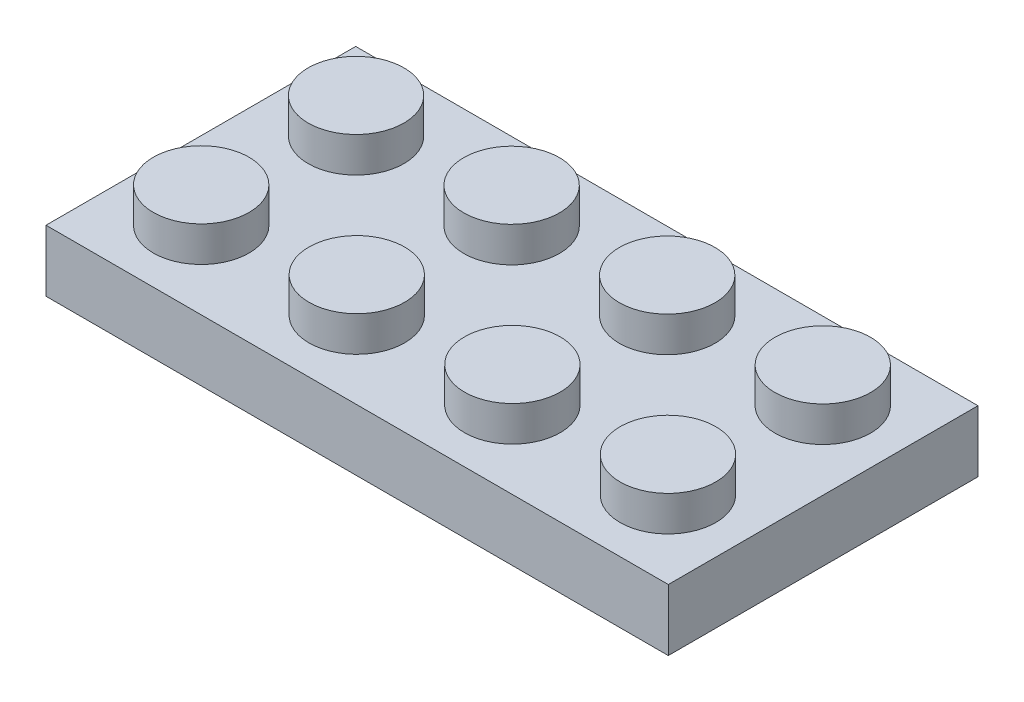
ISO-10303-21;
HEADER;
FILE_DESCRIPTION(('STEP AP214'),'2;1');
FILE_NAME('part.step','',(''),(''),'','','');
FILE_SCHEMA(('AUTOMOTIVE_DESIGN { 1 0 10303 214 1 1 1 1 }'));
ENDSEC;
DATA;
#1=APPLICATION_CONTEXT('core data for automotive mechanical design processes');
#2=APPLICATION_PROTOCOL_DEFINITION('international standard','automotive_design',2000,#1);
#3=PRODUCT_CONTEXT('',#1,'mechanical');
#4=PRODUCT('Part','Part','',(#3));
#5=PRODUCT_RELATED_PRODUCT_CATEGORY('part','',(#4));
#6=PRODUCT_DEFINITION_FORMATION('','',#4);
#7=PRODUCT_DEFINITION_CONTEXT('part definition',#1,'design');
#8=PRODUCT_DEFINITION('design','',#6,#7);
#9=PRODUCT_DEFINITION_SHAPE('','',#8);
#10=(LENGTH_UNIT() NAMED_UNIT(*) SI_UNIT(.MILLI.,.METRE.));
#11=(NAMED_UNIT(*) PLANE_ANGLE_UNIT() SI_UNIT($,.RADIAN.));
#12=(NAMED_UNIT(*) SI_UNIT($,.STERADIAN.) SOLID_ANGLE_UNIT());
#13=UNCERTAINTY_MEASURE_WITH_UNIT(LENGTH_MEASURE(1.E-05),#10,'distance_accuracy_value','');
#14=(GEOMETRIC_REPRESENTATION_CONTEXT(3) GLOBAL_UNCERTAINTY_ASSIGNED_CONTEXT((#13)) GLOBAL_UNIT_ASSIGNED_CONTEXT((#10,
#11,#12)) REPRESENTATION_CONTEXT('',''));
#15=CARTESIAN_POINT('',(0.,0.,0.));
#16=DIRECTION('',(0.,0.,1.));
#17=DIRECTION('',(1.,0.,0.));
#18=AXIS2_PLACEMENT_3D('',#15,#16,#17);
#19=CARTESIAN_POINT('',(15.925,-3.15,-7.925));
#20=DIRECTION('',(1.,0.,0.));
#21=DIRECTION('',(0.,0.,-1.));
#22=AXIS2_PLACEMENT_3D('',#19,#20,#21);
#23=PLANE('',#22);
#24=DIRECTION('',(0.,0.,-1.));
#25=VECTOR('',#24,1.);
#26=CARTESIAN_POINT('',(15.925,0.,-7.925));
#27=LINE('',#26,#25);
#28=CARTESIAN_POINT('',(15.925,0.,7.925));
#29=VERTEX_POINT('',#28);
#30=CARTESIAN_POINT('',(15.925,0.,-7.925));
#31=VERTEX_POINT('',#30);
#32=EDGE_CURVE('E243',#29,#31,#27,.T.);
#33=ORIENTED_EDGE('',*,*,#32,.F.);
#34=DIRECTION('',(0.,1.,0.));
#35=VECTOR('',#34,1.);
#36=CARTESIAN_POINT('',(15.925,-3.15,7.925));
#37=LINE('',#36,#35);
#38=CARTESIAN_POINT('',(15.925,-3.15,7.925));
#39=VERTEX_POINT('',#38);
#40=EDGE_CURVE('E58',#39,#29,#37,.T.);
#41=ORIENTED_EDGE('',*,*,#40,.F.);
#42=DIRECTION('',(0.,0.,-1.));
#43=VECTOR('',#42,1.);
#44=CARTESIAN_POINT('',(15.925,-3.15,-7.925));
#45=LINE('',#44,#43);
#46=CARTESIAN_POINT('',(15.925,-3.15,-7.925));
#47=VERTEX_POINT('',#46);
#48=EDGE_CURVE('E246',#39,#47,#45,.T.);
#49=ORIENTED_EDGE('',*,*,#48,.T.);
#50=DIRECTION('',(0.,1.,0.));
#51=VECTOR('',#50,1.);
#52=CARTESIAN_POINT('',(15.925,-3.15,-7.925));
#53=LINE('',#52,#51);
#54=EDGE_CURVE('E84',#47,#31,#53,.T.);
#55=ORIENTED_EDGE('',*,*,#54,.T.);
#56=EDGE_LOOP('',(#33,#41,#49,#55));
#57=FACE_BOUND('',#56,.T.);
#58=ADVANCED_FACE('F35',(#57),#23,.T.);
#59=CARTESIAN_POINT('',(-15.925,-3.15,7.925));
#60=DIRECTION('',(0.,0.,1.));
#61=DIRECTION('',(1.,0.,0.));
#62=AXIS2_PLACEMENT_3D('',#59,#60,#61);
#63=PLANE('',#62);
#64=DIRECTION('',(1.,0.,0.));
#65=VECTOR('',#64,1.);
#66=CARTESIAN_POINT('',(-15.925,0.,7.925));
#67=LINE('',#66,#65);
#68=CARTESIAN_POINT('',(-15.925,0.,7.925));
#69=VERTEX_POINT('',#68);
#70=EDGE_CURVE('E249',#69,#29,#67,.T.);
#71=ORIENTED_EDGE('',*,*,#70,.F.);
#72=DIRECTION('',(0.,1.,0.));
#73=VECTOR('',#72,1.);
#74=CARTESIAN_POINT('',(-15.925,-3.15,7.925));
#75=LINE('',#74,#73);
#76=CARTESIAN_POINT('',(-15.925,-3.15,7.925));
#77=VERTEX_POINT('',#76);
#78=EDGE_CURVE('E268',#77,#69,#75,.T.);
#79=ORIENTED_EDGE('',*,*,#78,.F.);
#80=DIRECTION('',(1.,0.,0.));
#81=VECTOR('',#80,1.);
#82=CARTESIAN_POINT('',(-15.925,-3.15,7.925));
#83=LINE('',#82,#81);
#84=EDGE_CURVE('E254',#77,#39,#83,.T.);
#85=ORIENTED_EDGE('',*,*,#84,.T.);
#86=ORIENTED_EDGE('',*,*,#40,.T.);
#87=EDGE_LOOP('',(#71,#79,#85,#86));
#88=FACE_BOUND('',#87,.T.);
#89=ADVANCED_FACE('F316',(#88),#63,.T.);
#90=CARTESIAN_POINT('',(-15.925,-3.15,-7.925));
#91=DIRECTION('',(-1.,0.,0.));
#92=DIRECTION('',(0.,0.,1.));
#93=AXIS2_PLACEMENT_3D('',#90,#91,#92);
#94=PLANE('',#93);
#95=DIRECTION('',(0.,0.,1.));
#96=VECTOR('',#95,1.);
#97=CARTESIAN_POINT('',(-15.925,0.,-7.925));
#98=LINE('',#97,#96);
#99=CARTESIAN_POINT('',(-15.925,0.,-7.925));
#100=VERTEX_POINT('',#99);
#101=EDGE_CURVE('E261',#100,#69,#98,.T.);
#102=ORIENTED_EDGE('',*,*,#101,.F.);
#103=DIRECTION('',(0.,1.,0.));
#104=VECTOR('',#103,1.);
#105=CARTESIAN_POINT('',(-15.925,-3.15,-7.925));
#106=LINE('',#105,#104);
#107=CARTESIAN_POINT('',(-15.925,-3.15,-7.925));
#108=VERTEX_POINT('',#107);
#109=EDGE_CURVE('E270',#108,#100,#106,.T.);
#110=ORIENTED_EDGE('',*,*,#109,.F.);
#111=DIRECTION('',(0.,0.,1.));
#112=VECTOR('',#111,1.);
#113=CARTESIAN_POINT('',(-15.925,-3.15,-7.925));
#114=LINE('',#113,#112);
#115=EDGE_CURVE('E251',#108,#77,#114,.T.);
#116=ORIENTED_EDGE('',*,*,#115,.T.);
#117=ORIENTED_EDGE('',*,*,#78,.T.);
#118=EDGE_LOOP('',(#102,#110,#116,#117));
#119=FACE_BOUND('',#118,.T.);
#120=ADVANCED_FACE('F320',(#119),#94,.T.);
#121=CARTESIAN_POINT('',(-15.925,-3.15,-7.925));
#122=DIRECTION('',(0.,0.,-1.));
#123=DIRECTION('',(-1.,0.,0.));
#124=AXIS2_PLACEMENT_3D('',#121,#122,#123);
#125=PLANE('',#124);
#126=DIRECTION('',(-1.,0.,0.));
#127=VECTOR('',#126,1.);
#128=CARTESIAN_POINT('',(-15.925,0.,-7.925));
#129=LINE('',#128,#127);
#130=EDGE_CURVE('E258',#31,#100,#129,.T.);
#131=ORIENTED_EDGE('',*,*,#130,.F.);
#132=ORIENTED_EDGE('',*,*,#54,.F.);
#133=DIRECTION('',(-1.,0.,0.));
#134=VECTOR('',#133,1.);
#135=CARTESIAN_POINT('',(-15.925,-3.15,-7.925));
#136=LINE('',#135,#134);
#137=EDGE_CURVE('E248',#47,#108,#136,.T.);
#138=ORIENTED_EDGE('',*,*,#137,.T.);
#139=ORIENTED_EDGE('',*,*,#109,.T.);
#140=EDGE_LOOP('',(#131,#132,#138,#139));
#141=FACE_BOUND('',#140,.T.);
#142=ADVANCED_FACE('F330',(#141),#125,.T.);
#143=CARTESIAN_POINT('',(0.,-3.15,0.));
#144=DIRECTION('',(0.,1.,0.));
#145=DIRECTION('',(0.,0.,1.));
#146=AXIS2_PLACEMENT_3D('',#143,#144,#145);
#147=PLANE('',#146);
#148=DIRECTION('',(1.,0.,0.));
#149=VECTOR('',#148,1.);
#150=CARTESIAN_POINT('',(0.,-3.15,6.425));
#151=LINE('',#150,#149);
#152=CARTESIAN_POINT('',(-14.425,-3.15,6.425));
#153=VERTEX_POINT('',#152);
#154=CARTESIAN_POINT('',(14.425,-3.15,6.425));
#155=VERTEX_POINT('',#154);
#156=EDGE_CURVE('E193',#153,#155,#151,.T.);
#157=ORIENTED_EDGE('',*,*,#156,.T.);
#158=DIRECTION('',(0.,0.,-1.));
#159=VECTOR('',#158,1.);
#160=CARTESIAN_POINT('',(14.425,-3.15,0.));
#161=LINE('',#160,#159);
#162=CARTESIAN_POINT('',(14.425,-3.15,-6.425));
#163=VERTEX_POINT('',#162);
#164=EDGE_CURVE('E113',#155,#163,#161,.T.);
#165=ORIENTED_EDGE('',*,*,#164,.T.);
#166=DIRECTION('',(-1.,0.,0.));
#167=VECTOR('',#166,1.);
#168=CARTESIAN_POINT('',(0.,-3.15,-6.425));
#169=LINE('',#168,#167);
#170=CARTESIAN_POINT('',(-14.425,-3.15,-6.425));
#171=VERTEX_POINT('',#170);
#172=EDGE_CURVE('E135',#163,#171,#169,.T.);
#173=ORIENTED_EDGE('',*,*,#172,.T.);
#174=DIRECTION('',(0.,0.,1.));
#175=VECTOR('',#174,1.);
#176=CARTESIAN_POINT('',(-14.425,-3.15,0.));
#177=LINE('',#176,#175);
#178=EDGE_CURVE('E49',#171,#153,#177,.T.);
#179=ORIENTED_EDGE('',*,*,#178,.T.);
#180=EDGE_LOOP('',(#157,#165,#173,#179));
#181=FACE_BOUND('',#180,.T.);
#182=ORIENTED_EDGE('',*,*,#48,.F.);
#183=ORIENTED_EDGE('',*,*,#84,.F.);
#184=ORIENTED_EDGE('',*,*,#115,.F.);
#185=ORIENTED_EDGE('',*,*,#137,.F.);
#186=EDGE_LOOP('',(#182,#183,#184,#185));
#187=FACE_BOUND('',#186,.T.);
#188=ADVANCED_FACE('F329',(#181,#187),#147,.F.);
#189=CARTESIAN_POINT('',(0.,0.,0.));
#190=DIRECTION('',(0.,1.,0.));
#191=DIRECTION('',(0.,0.,1.));
#192=AXIS2_PLACEMENT_3D('',#189,#190,#191);
#193=PLANE('',#192);
#194=CARTESIAN_POINT('',(-11.94375,0.,3.9625));
#195=DIRECTION('',(0.,1.,0.));
#196=DIRECTION('',(0.,0.,1.));
#197=AXIS2_PLACEMENT_3D('',#194,#195,#196);
#198=CIRCLE('',#197,2.45);
#199=CARTESIAN_POINT('',(-11.94375,0.,6.4125));
#200=VERTEX_POINT('',#199);
#201=EDGE_CURVE('E118',#200,#200,#198,.T.);
#202=ORIENTED_EDGE('',*,*,#201,.F.);
#203=EDGE_LOOP('',(#202));
#204=FACE_BOUND('',#203,.T.);
#205=CARTESIAN_POINT('',(11.94375,0.,3.9625));
#206=DIRECTION('',(0.,1.,0.));
#207=DIRECTION('',(0.,0.,1.));
#208=AXIS2_PLACEMENT_3D('',#205,#206,#207);
#209=CIRCLE('',#208,2.45);
#210=CARTESIAN_POINT('',(11.94375,0.,6.4125));
#211=VERTEX_POINT('',#210);
#212=EDGE_CURVE('E201',#211,#211,#209,.T.);
#213=ORIENTED_EDGE('',*,*,#212,.F.);
#214=EDGE_LOOP('',(#213));
#215=FACE_BOUND('',#214,.T.);
#216=CARTESIAN_POINT('',(3.98125,0.,3.9625));
#217=DIRECTION('',(0.,1.,0.));
#218=DIRECTION('',(0.,0.,1.));
#219=AXIS2_PLACEMENT_3D('',#216,#217,#218);
#220=CIRCLE('',#219,2.45);
#221=CARTESIAN_POINT('',(3.98125,0.,6.4125));
#222=VERTEX_POINT('',#221);
#223=EDGE_CURVE('E207',#222,#222,#220,.T.);
#224=ORIENTED_EDGE('',*,*,#223,.F.);
#225=EDGE_LOOP('',(#224));
#226=FACE_BOUND('',#225,.T.);
#227=CARTESIAN_POINT('',(-3.98125,0.,3.9625));
#228=DIRECTION('',(0.,1.,0.));
#229=DIRECTION('',(0.,0.,1.));
#230=AXIS2_PLACEMENT_3D('',#227,#228,#229);
#231=CIRCLE('',#230,2.45);
#232=CARTESIAN_POINT('',(-3.98125,0.,6.4125));
#233=VERTEX_POINT('',#232);
#234=EDGE_CURVE('E213',#233,#233,#231,.T.);
#235=ORIENTED_EDGE('',*,*,#234,.F.);
#236=EDGE_LOOP('',(#235));
#237=FACE_BOUND('',#236,.T.);
#238=CARTESIAN_POINT('',(11.94375,0.,-3.9625));
#239=DIRECTION('',(0.,1.,0.));
#240=DIRECTION('',(0.,0.,1.));
#241=AXIS2_PLACEMENT_3D('',#238,#239,#240);
#242=CIRCLE('',#241,2.45);
#243=CARTESIAN_POINT('',(11.94375,0.,-1.5125));
#244=VERTEX_POINT('',#243);
#245=EDGE_CURVE('E219',#244,#244,#242,.T.);
#246=ORIENTED_EDGE('',*,*,#245,.F.);
#247=EDGE_LOOP('',(#246));
#248=FACE_BOUND('',#247,.T.);
#249=CARTESIAN_POINT('',(3.98125,0.,-3.9625));
#250=DIRECTION('',(0.,1.,0.));
#251=DIRECTION('',(0.,0.,1.));
#252=AXIS2_PLACEMENT_3D('',#249,#250,#251);
#253=CIRCLE('',#252,2.45);
#254=CARTESIAN_POINT('',(3.98125,0.,-1.5125));
#255=VERTEX_POINT('',#254);
#256=EDGE_CURVE('E225',#255,#255,#253,.T.);
#257=ORIENTED_EDGE('',*,*,#256,.F.);
#258=EDGE_LOOP('',(#257));
#259=FACE_BOUND('',#258,.T.);
#260=CARTESIAN_POINT('',(-3.98125,0.,-3.9625));
#261=DIRECTION('',(0.,1.,0.));
#262=DIRECTION('',(0.,0.,1.));
#263=AXIS2_PLACEMENT_3D('',#260,#261,#262);
#264=CIRCLE('',#263,2.45);
#265=CARTESIAN_POINT('',(-3.98125,0.,-1.5125));
#266=VERTEX_POINT('',#265);
#267=EDGE_CURVE('E231',#266,#266,#264,.T.);
#268=ORIENTED_EDGE('',*,*,#267,.F.);
#269=EDGE_LOOP('',(#268));
#270=FACE_BOUND('',#269,.T.);
#271=CARTESIAN_POINT('',(-11.94375,0.,-3.9625));
#272=DIRECTION('',(0.,1.,0.));
#273=DIRECTION('',(0.,0.,1.));
#274=AXIS2_PLACEMENT_3D('',#271,#272,#273);
#275=CIRCLE('',#274,2.45);
#276=CARTESIAN_POINT('',(-11.94375,0.,-1.5125));
#277=VERTEX_POINT('',#276);
#278=EDGE_CURVE('E237',#277,#277,#275,.T.);
#279=ORIENTED_EDGE('',*,*,#278,.F.);
#280=EDGE_LOOP('',(#279));
#281=FACE_BOUND('',#280,.T.);
#282=ORIENTED_EDGE('',*,*,#32,.T.);
#283=ORIENTED_EDGE('',*,*,#130,.T.);
#284=ORIENTED_EDGE('',*,*,#101,.T.);
#285=ORIENTED_EDGE('',*,*,#70,.T.);
#286=EDGE_LOOP('',(#282,#283,#284,#285));
#287=FACE_BOUND('',#286,.T.);
#288=ADVANCED_FACE('F323',(#204,#215,#226,#237,#248,#259,#270,#281,#287),#193,.T.);
#289=CARTESIAN_POINT('',(-11.94375,1.8,-3.9625));
#290=DIRECTION('',(0.,-1.,0.));
#291=DIRECTION('',(0.,0.,-1.));
#292=AXIS2_PLACEMENT_3D('',#289,#290,#291);
#293=CYLINDRICAL_SURFACE('',#292,2.45);
#294=CARTESIAN_POINT('',(-11.94375,1.8,-3.9625));
#295=DIRECTION('',(0.,1.,0.));
#296=DIRECTION('',(0.,0.,1.));
#297=AXIS2_PLACEMENT_3D('',#294,#295,#296);
#298=CIRCLE('',#297,2.45);
#299=CARTESIAN_POINT('',(-11.94375,1.8,-1.5125));
#300=VERTEX_POINT('',#299);
#301=EDGE_CURVE('E240',#300,#300,#298,.T.);
#302=ORIENTED_EDGE('',*,*,#301,.F.);
#303=EDGE_LOOP('',(#302));
#304=FACE_BOUND('',#303,.T.);
#305=ORIENTED_EDGE('',*,*,#278,.T.);
#306=EDGE_LOOP('',(#305));
#307=FACE_BOUND('',#306,.T.);
#308=ADVANCED_FACE('F341',(#304,#307),#293,.T.);
#309=CARTESIAN_POINT('',(-11.94375,1.8,-3.9625));
#310=DIRECTION('',(0.,1.,0.));
#311=DIRECTION('',(0.,0.,1.));
#312=AXIS2_PLACEMENT_3D('',#309,#310,#311);
#313=PLANE('',#312);
#314=ORIENTED_EDGE('',*,*,#301,.T.);
#315=EDGE_LOOP('',(#314));
#316=FACE_BOUND('',#315,.T.);
#317=ADVANCED_FACE('F346',(#316),#313,.T.);
#318=CARTESIAN_POINT('',(-3.98125,1.8,-3.9625));
#319=DIRECTION('',(0.,-1.,0.));
#320=DIRECTION('',(0.,0.,-1.));
#321=AXIS2_PLACEMENT_3D('',#318,#319,#320);
#322=CYLINDRICAL_SURFACE('',#321,2.45);
#323=CARTESIAN_POINT('',(-3.98125,1.8,-3.9625));
#324=DIRECTION('',(0.,1.,0.));
#325=DIRECTION('',(0.,0.,1.));
#326=AXIS2_PLACEMENT_3D('',#323,#324,#325);
#327=CIRCLE('',#326,2.45);
#328=CARTESIAN_POINT('',(-3.98125,1.8,-1.5125));
#329=VERTEX_POINT('',#328);
#330=EDGE_CURVE('E234',#329,#329,#327,.T.);
#331=ORIENTED_EDGE('',*,*,#330,.F.);
#332=EDGE_LOOP('',(#331));
#333=FACE_BOUND('',#332,.T.);
#334=ORIENTED_EDGE('',*,*,#267,.T.);
#335=EDGE_LOOP('',(#334));
#336=FACE_BOUND('',#335,.T.);
#337=ADVANCED_FACE('F350',(#333,#336),#322,.T.);
#338=CARTESIAN_POINT('',(-3.98125,1.8,-3.9625));
#339=DIRECTION('',(0.,1.,0.));
#340=DIRECTION('',(0.,0.,1.));
#341=AXIS2_PLACEMENT_3D('',#338,#339,#340);
#342=PLANE('',#341);
#343=ORIENTED_EDGE('',*,*,#330,.T.);
#344=EDGE_LOOP('',(#343));
#345=FACE_BOUND('',#344,.T.);
#346=ADVANCED_FACE('F354',(#345),#342,.T.);
#347=CARTESIAN_POINT('',(3.98125,1.8,-3.9625));
#348=DIRECTION('',(0.,-1.,0.));
#349=DIRECTION('',(0.,0.,-1.));
#350=AXIS2_PLACEMENT_3D('',#347,#348,#349);
#351=CYLINDRICAL_SURFACE('',#350,2.45);
#352=CARTESIAN_POINT('',(3.98125,1.8,-3.9625));
#353=DIRECTION('',(0.,1.,0.));
#354=DIRECTION('',(0.,0.,1.));
#355=AXIS2_PLACEMENT_3D('',#352,#353,#354);
#356=CIRCLE('',#355,2.45);
#357=CARTESIAN_POINT('',(3.98125,1.8,-1.5125));
#358=VERTEX_POINT('',#357);
#359=EDGE_CURVE('E228',#358,#358,#356,.T.);
#360=ORIENTED_EDGE('',*,*,#359,.F.);
#361=EDGE_LOOP('',(#360));
#362=FACE_BOUND('',#361,.T.);
#363=ORIENTED_EDGE('',*,*,#256,.T.);
#364=EDGE_LOOP('',(#363));
#365=FACE_BOUND('',#364,.T.);
#366=ADVANCED_FACE('F358',(#362,#365),#351,.T.);
#367=CARTESIAN_POINT('',(3.98125,1.8,-3.9625));
#368=DIRECTION('',(0.,1.,0.));
#369=DIRECTION('',(0.,0.,1.));
#370=AXIS2_PLACEMENT_3D('',#367,#368,#369);
#371=PLANE('',#370);
#372=ORIENTED_EDGE('',*,*,#359,.T.);
#373=EDGE_LOOP('',(#372));
#374=FACE_BOUND('',#373,.T.);
#375=ADVANCED_FACE('F362',(#374),#371,.T.);
#376=CARTESIAN_POINT('',(11.94375,1.8,-3.9625));
#377=DIRECTION('',(0.,-1.,0.));
#378=DIRECTION('',(0.,0.,-1.));
#379=AXIS2_PLACEMENT_3D('',#376,#377,#378);
#380=CYLINDRICAL_SURFACE('',#379,2.45);
#381=CARTESIAN_POINT('',(11.94375,1.8,-3.9625));
#382=DIRECTION('',(0.,1.,0.));
#383=DIRECTION('',(0.,0.,1.));
#384=AXIS2_PLACEMENT_3D('',#381,#382,#383);
#385=CIRCLE('',#384,2.45);
#386=CARTESIAN_POINT('',(11.94375,1.8,-1.5125));
#387=VERTEX_POINT('',#386);
#388=EDGE_CURVE('E222',#387,#387,#385,.T.);
#389=ORIENTED_EDGE('',*,*,#388,.F.);
#390=EDGE_LOOP('',(#389));
#391=FACE_BOUND('',#390,.T.);
#392=ORIENTED_EDGE('',*,*,#245,.T.);
#393=EDGE_LOOP('',(#392));
#394=FACE_BOUND('',#393,.T.);
#395=ADVANCED_FACE('F366',(#391,#394),#380,.T.);
#396=CARTESIAN_POINT('',(11.94375,1.8,-3.9625));
#397=DIRECTION('',(0.,1.,0.));
#398=DIRECTION('',(0.,0.,1.));
#399=AXIS2_PLACEMENT_3D('',#396,#397,#398);
#400=PLANE('',#399);
#401=ORIENTED_EDGE('',*,*,#388,.T.);
#402=EDGE_LOOP('',(#401));
#403=FACE_BOUND('',#402,.T.);
#404=ADVANCED_FACE('F370',(#403),#400,.T.);
#405=CARTESIAN_POINT('',(-3.98125,1.8,3.9625));
#406=DIRECTION('',(0.,-1.,0.));
#407=DIRECTION('',(0.,0.,-1.));
#408=AXIS2_PLACEMENT_3D('',#405,#406,#407);
#409=CYLINDRICAL_SURFACE('',#408,2.45);
#410=CARTESIAN_POINT('',(-3.98125,1.8,3.9625));
#411=DIRECTION('',(0.,1.,0.));
#412=DIRECTION('',(0.,0.,1.));
#413=AXIS2_PLACEMENT_3D('',#410,#411,#412);
#414=CIRCLE('',#413,2.45);
#415=CARTESIAN_POINT('',(-3.98125,1.8,6.4125));
#416=VERTEX_POINT('',#415);
#417=EDGE_CURVE('E216',#416,#416,#414,.T.);
#418=ORIENTED_EDGE('',*,*,#417,.F.);
#419=EDGE_LOOP('',(#418));
#420=FACE_BOUND('',#419,.T.);
#421=ORIENTED_EDGE('',*,*,#234,.T.);
#422=EDGE_LOOP('',(#421));
#423=FACE_BOUND('',#422,.T.);
#424=ADVANCED_FACE('F374',(#420,#423),#409,.T.);
#425=CARTESIAN_POINT('',(-3.98125,1.8,3.9625));
#426=DIRECTION('',(0.,1.,0.));
#427=DIRECTION('',(0.,0.,1.));
#428=AXIS2_PLACEMENT_3D('',#425,#426,#427);
#429=PLANE('',#428);
#430=ORIENTED_EDGE('',*,*,#417,.T.);
#431=EDGE_LOOP('',(#430));
#432=FACE_BOUND('',#431,.T.);
#433=ADVANCED_FACE('F378',(#432),#429,.T.);
#434=CARTESIAN_POINT('',(3.98125,1.8,3.9625));
#435=DIRECTION('',(0.,-1.,0.));
#436=DIRECTION('',(0.,0.,-1.));
#437=AXIS2_PLACEMENT_3D('',#434,#435,#436);
#438=CYLINDRICAL_SURFACE('',#437,2.45);
#439=CARTESIAN_POINT('',(3.98125,1.8,3.9625));
#440=DIRECTION('',(0.,1.,0.));
#441=DIRECTION('',(0.,0.,1.));
#442=AXIS2_PLACEMENT_3D('',#439,#440,#441);
#443=CIRCLE('',#442,2.45);
#444=CARTESIAN_POINT('',(3.98125,1.8,6.4125));
#445=VERTEX_POINT('',#444);
#446=EDGE_CURVE('E210',#445,#445,#443,.T.);
#447=ORIENTED_EDGE('',*,*,#446,.F.);
#448=EDGE_LOOP('',(#447));
#449=FACE_BOUND('',#448,.T.);
#450=ORIENTED_EDGE('',*,*,#223,.T.);
#451=EDGE_LOOP('',(#450));
#452=FACE_BOUND('',#451,.T.);
#453=ADVANCED_FACE('F382',(#449,#452),#438,.T.);
#454=CARTESIAN_POINT('',(3.98125,1.8,3.9625));
#455=DIRECTION('',(0.,1.,0.));
#456=DIRECTION('',(0.,0.,1.));
#457=AXIS2_PLACEMENT_3D('',#454,#455,#456);
#458=PLANE('',#457);
#459=ORIENTED_EDGE('',*,*,#446,.T.);
#460=EDGE_LOOP('',(#459));
#461=FACE_BOUND('',#460,.T.);
#462=ADVANCED_FACE('F386',(#461),#458,.T.);
#463=CARTESIAN_POINT('',(11.94375,1.8,3.9625));
#464=DIRECTION('',(0.,-1.,0.));
#465=DIRECTION('',(0.,0.,-1.));
#466=AXIS2_PLACEMENT_3D('',#463,#464,#465);
#467=CYLINDRICAL_SURFACE('',#466,2.45);
#468=CARTESIAN_POINT('',(11.94375,1.8,3.9625));
#469=DIRECTION('',(0.,1.,0.));
#470=DIRECTION('',(0.,0.,1.));
#471=AXIS2_PLACEMENT_3D('',#468,#469,#470);
#472=CIRCLE('',#471,2.45);
#473=CARTESIAN_POINT('',(11.94375,1.8,6.4125));
#474=VERTEX_POINT('',#473);
#475=EDGE_CURVE('E204',#474,#474,#472,.T.);
#476=ORIENTED_EDGE('',*,*,#475,.F.);
#477=EDGE_LOOP('',(#476));
#478=FACE_BOUND('',#477,.T.);
#479=ORIENTED_EDGE('',*,*,#212,.T.);
#480=EDGE_LOOP('',(#479));
#481=FACE_BOUND('',#480,.T.);
#482=ADVANCED_FACE('F390',(#478,#481),#467,.T.);
#483=CARTESIAN_POINT('',(11.94375,1.8,3.9625));
#484=DIRECTION('',(0.,1.,0.));
#485=DIRECTION('',(0.,0.,1.));
#486=AXIS2_PLACEMENT_3D('',#483,#484,#485);
#487=PLANE('',#486);
#488=ORIENTED_EDGE('',*,*,#475,.T.);
#489=EDGE_LOOP('',(#488));
#490=FACE_BOUND('',#489,.T.);
#491=ADVANCED_FACE('F394',(#490),#487,.T.);
#492=CARTESIAN_POINT('',(-11.94375,1.8,3.9625));
#493=DIRECTION('',(0.,-1.,0.));
#494=DIRECTION('',(0.,0.,-1.));
#495=AXIS2_PLACEMENT_3D('',#492,#493,#494);
#496=CYLINDRICAL_SURFACE('',#495,2.45);
#497=CARTESIAN_POINT('',(-11.94375,1.8,3.9625));
#498=DIRECTION('',(0.,1.,0.));
#499=DIRECTION('',(0.,0.,1.));
#500=AXIS2_PLACEMENT_3D('',#497,#498,#499);
#501=CIRCLE('',#500,2.45);
#502=CARTESIAN_POINT('',(-11.94375,1.8,6.4125));
#503=VERTEX_POINT('',#502);
#504=EDGE_CURVE('E198',#503,#503,#501,.T.);
#505=ORIENTED_EDGE('',*,*,#504,.F.);
#506=EDGE_LOOP('',(#505));
#507=FACE_BOUND('',#506,.T.);
#508=ORIENTED_EDGE('',*,*,#201,.T.);
#509=EDGE_LOOP('',(#508));
#510=FACE_BOUND('',#509,.T.);
#511=ADVANCED_FACE('F398',(#507,#510),#496,.T.);
#512=CARTESIAN_POINT('',(-11.94375,1.8,3.9625));
#513=DIRECTION('',(0.,1.,0.));
#514=DIRECTION('',(0.,0.,1.));
#515=AXIS2_PLACEMENT_3D('',#512,#513,#514);
#516=PLANE('',#515);
#517=ORIENTED_EDGE('',*,*,#504,.T.);
#518=EDGE_LOOP('',(#517));
#519=FACE_BOUND('',#518,.T.);
#520=ADVANCED_FACE('F402',(#519),#516,.T.);
#521=CARTESIAN_POINT('',(14.425,-3.15,-7.925));
#522=DIRECTION('',(1.,0.,0.));
#523=DIRECTION('',(0.,0.,-1.));
#524=AXIS2_PLACEMENT_3D('',#521,#522,#523);
#525=PLANE('',#524);
#526=DIRECTION('',(0.,0.,-1.));
#527=VECTOR('',#526,1.);
#528=CARTESIAN_POINT('',(14.425,-1.5,0.));
#529=LINE('',#528,#527);
#530=CARTESIAN_POINT('',(14.425,-1.5,6.425));
#531=VERTEX_POINT('',#530);
#532=CARTESIAN_POINT('',(14.425,-1.5,-6.425));
#533=VERTEX_POINT('',#532);
#534=EDGE_CURVE('E111',#531,#533,#529,.T.);
#535=ORIENTED_EDGE('',*,*,#534,.T.);
#536=DIRECTION('',(0.,1.,0.));
#537=VECTOR('',#536,1.);
#538=CARTESIAN_POINT('',(14.425,-3.15,-6.425));
#539=LINE('',#538,#537);
#540=EDGE_CURVE('E140',#163,#533,#539,.T.);
#541=ORIENTED_EDGE('',*,*,#540,.F.);
#542=ORIENTED_EDGE('',*,*,#164,.F.);
#543=DIRECTION('',(0.,1.,0.));
#544=VECTOR('',#543,1.);
#545=CARTESIAN_POINT('',(14.425,-3.15,6.425));
#546=LINE('',#545,#544);
#547=EDGE_CURVE('E108',#155,#531,#546,.T.);
#548=ORIENTED_EDGE('',*,*,#547,.T.);
#549=EDGE_LOOP('',(#535,#541,#542,#548));
#550=FACE_BOUND('',#549,.T.);
#551=ADVANCED_FACE('F110',(#550),#525,.F.);
#552=CARTESIAN_POINT('',(-15.925,-3.15,6.425));
#553=DIRECTION('',(0.,0.,1.));
#554=DIRECTION('',(1.,0.,0.));
#555=AXIS2_PLACEMENT_3D('',#552,#553,#554);
#556=PLANE('',#555);
#557=DIRECTION('',(1.,0.,0.));
#558=VECTOR('',#557,1.);
#559=CARTESIAN_POINT('',(0.,-1.5,6.425));
#560=LINE('',#559,#558);
#561=CARTESIAN_POINT('',(-14.425,-1.5,6.425));
#562=VERTEX_POINT('',#561);
#563=EDGE_CURVE('E126',#562,#531,#560,.T.);
#564=ORIENTED_EDGE('',*,*,#563,.T.);
#565=ORIENTED_EDGE('',*,*,#547,.F.);
#566=ORIENTED_EDGE('',*,*,#156,.F.);
#567=DIRECTION('',(0.,1.,0.));
#568=VECTOR('',#567,1.);
#569=CARTESIAN_POINT('',(-14.425,-3.15,6.425));
#570=LINE('',#569,#568);
#571=EDGE_CURVE('E119',#153,#562,#570,.T.);
#572=ORIENTED_EDGE('',*,*,#571,.T.);
#573=EDGE_LOOP('',(#564,#565,#566,#572));
#574=FACE_BOUND('',#573,.T.);
#575=ADVANCED_FACE('F131',(#574),#556,.F.);
#576=CARTESIAN_POINT('',(-14.425,-3.15,-7.925));
#577=DIRECTION('',(-1.,0.,0.));
#578=DIRECTION('',(0.,0.,1.));
#579=AXIS2_PLACEMENT_3D('',#576,#577,#578);
#580=PLANE('',#579);
#581=DIRECTION('',(0.,0.,1.));
#582=VECTOR('',#581,1.);
#583=CARTESIAN_POINT('',(-14.425,-1.5,0.));
#584=LINE('',#583,#582);
#585=CARTESIAN_POINT('',(-14.425,-1.5,-6.425));
#586=VERTEX_POINT('',#585);
#587=EDGE_CURVE('E133',#586,#562,#584,.T.);
#588=ORIENTED_EDGE('',*,*,#587,.T.);
#589=ORIENTED_EDGE('',*,*,#571,.F.);
#590=ORIENTED_EDGE('',*,*,#178,.F.);
#591=DIRECTION('',(0.,1.,0.));
#592=VECTOR('',#591,1.);
#593=CARTESIAN_POINT('',(-14.425,-3.15,-6.425));
#594=LINE('',#593,#592);
#595=EDGE_CURVE('E141',#171,#586,#594,.T.);
#596=ORIENTED_EDGE('',*,*,#595,.T.);
#597=EDGE_LOOP('',(#588,#589,#590,#596));
#598=FACE_BOUND('',#597,.T.);
#599=ADVANCED_FACE('F682',(#598),#580,.F.);
#600=CARTESIAN_POINT('',(-15.925,-3.15,-6.425));
#601=DIRECTION('',(0.,0.,-1.));
#602=DIRECTION('',(-1.,0.,0.));
#603=AXIS2_PLACEMENT_3D('',#600,#601,#602);
#604=PLANE('',#603);
#605=DIRECTION('',(-1.,0.,0.));
#606=VECTOR('',#605,1.);
#607=CARTESIAN_POINT('',(0.,-1.5,-6.425));
#608=LINE('',#607,#606);
#609=EDGE_CURVE('E128',#533,#586,#608,.T.);
#610=ORIENTED_EDGE('',*,*,#609,.T.);
#611=ORIENTED_EDGE('',*,*,#595,.F.);
#612=ORIENTED_EDGE('',*,*,#172,.F.);
#613=ORIENTED_EDGE('',*,*,#540,.T.);
#614=EDGE_LOOP('',(#610,#611,#612,#613));
#615=FACE_BOUND('',#614,.T.);
#616=ADVANCED_FACE('F282',(#615),#604,.F.);
#617=CARTESIAN_POINT('',(0.,-1.5,0.));
#618=DIRECTION('',(0.,1.,0.));
#619=DIRECTION('',(0.,0.,1.));
#620=AXIS2_PLACEMENT_3D('',#617,#618,#619);
#621=PLANE('',#620);
#622=CARTESIAN_POINT('',(-7.9625,-1.5,0.));
#623=DIRECTION('',(0.,1.,0.));
#624=DIRECTION('',(0.,0.,1.));
#625=AXIS2_PLACEMENT_3D('',#622,#623,#624);
#626=CIRCLE('',#625,3.23);
#627=CARTESIAN_POINT('',(-7.9625,-1.5,3.23));
#628=VERTEX_POINT('',#627);
#629=EDGE_CURVE('E12',#628,#628,#626,.F.);
#630=ORIENTED_EDGE('',*,*,#629,.F.);
#631=EDGE_LOOP('',(#630));
#632=FACE_BOUND('',#631,.T.);
#633=CARTESIAN_POINT('',(7.9625,-1.5,0.));
#634=DIRECTION('',(0.,1.,0.));
#635=DIRECTION('',(0.,0.,1.));
#636=AXIS2_PLACEMENT_3D('',#633,#634,#635);
#637=CIRCLE('',#636,3.23);
#638=CARTESIAN_POINT('',(7.9625,-1.5,3.23));
#639=VERTEX_POINT('',#638);
#640=EDGE_CURVE('E42',#639,#639,#637,.F.);
#641=ORIENTED_EDGE('',*,*,#640,.F.);
#642=EDGE_LOOP('',(#641));
#643=FACE_BOUND('',#642,.T.);
#644=CARTESIAN_POINT('',(0.,-1.5,0.));
#645=DIRECTION('',(0.,1.,0.));
#646=DIRECTION('',(0.,0.,1.));
#647=AXIS2_PLACEMENT_3D('',#644,#645,#646);
#648=CIRCLE('',#647,3.23);
#649=CARTESIAN_POINT('',(0.,-1.5,3.23));
#650=VERTEX_POINT('',#649);
#651=EDGE_CURVE('E267',#650,#650,#648,.F.);
#652=ORIENTED_EDGE('',*,*,#651,.F.);
#653=EDGE_LOOP('',(#652));
#654=FACE_BOUND('',#653,.T.);
#655=CARTESIAN_POINT('',(-11.94375,-1.5,3.9625));
#656=DIRECTION('',(0.,1.,0.));
#657=DIRECTION('',(0.,0.,1.));
#658=AXIS2_PLACEMENT_3D('',#655,#656,#657);
#659=CIRCLE('',#658,0.950000000000003);
#660=CARTESIAN_POINT('',(-11.94375,-1.5,4.9125));
#661=VERTEX_POINT('',#660);
#662=EDGE_CURVE('E145',#661,#661,#659,.T.);
#663=ORIENTED_EDGE('',*,*,#662,.T.);
#664=EDGE_LOOP('',(#663));
#665=FACE_BOUND('',#664,.T.);
#666=CARTESIAN_POINT('',(11.94375,-1.5,3.9625));
#667=DIRECTION('',(0.,1.,0.));
#668=DIRECTION('',(0.,0.,1.));
#669=AXIS2_PLACEMENT_3D('',#666,#667,#668);
#670=CIRCLE('',#669,0.950000000000003);
#671=CARTESIAN_POINT('',(11.94375,-1.5,4.9125));
#672=VERTEX_POINT('',#671);
#673=EDGE_CURVE('E150',#672,#672,#670,.T.);
#674=ORIENTED_EDGE('',*,*,#673,.T.);
#675=EDGE_LOOP('',(#674));
#676=FACE_BOUND('',#675,.T.);
#677=CARTESIAN_POINT('',(3.98125,-1.5,3.9625));
#678=DIRECTION('',(0.,1.,0.));
#679=DIRECTION('',(0.,0.,1.));
#680=AXIS2_PLACEMENT_3D('',#677,#678,#679);
#681=CIRCLE('',#680,0.950000000000003);
#682=CARTESIAN_POINT('',(3.98125,-1.5,4.9125));
#683=VERTEX_POINT('',#682);
#684=EDGE_CURVE('E154',#683,#683,#681,.T.);
#685=ORIENTED_EDGE('',*,*,#684,.T.);
#686=EDGE_LOOP('',(#685));
#687=FACE_BOUND('',#686,.T.);
#688=CARTESIAN_POINT('',(-3.98125,-1.5,3.9625));
#689=DIRECTION('',(0.,1.,0.));
#690=DIRECTION('',(0.,0.,1.));
#691=AXIS2_PLACEMENT_3D('',#688,#689,#690);
#692=CIRCLE('',#691,0.950000000000003);
#693=CARTESIAN_POINT('',(-3.98125,-1.5,4.9125));
#694=VERTEX_POINT('',#693);
#695=EDGE_CURVE('E158',#694,#694,#692,.T.);
#696=ORIENTED_EDGE('',*,*,#695,.T.);
#697=EDGE_LOOP('',(#696));
#698=FACE_BOUND('',#697,.T.);
#699=CARTESIAN_POINT('',(11.94375,-1.5,-3.9625));
#700=DIRECTION('',(0.,1.,0.));
#701=DIRECTION('',(0.,0.,1.));
#702=AXIS2_PLACEMENT_3D('',#699,#700,#701);
#703=CIRCLE('',#702,0.950000000000003);
#704=CARTESIAN_POINT('',(11.94375,-1.5,-3.0125));
#705=VERTEX_POINT('',#704);
#706=EDGE_CURVE('E162',#705,#705,#703,.T.);
#707=ORIENTED_EDGE('',*,*,#706,.T.);
#708=EDGE_LOOP('',(#707));
#709=FACE_BOUND('',#708,.T.);
#710=CARTESIAN_POINT('',(3.98125,-1.5,-3.9625));
#711=DIRECTION('',(0.,1.,0.));
#712=DIRECTION('',(0.,0.,1.));
#713=AXIS2_PLACEMENT_3D('',#710,#711,#712);
#714=CIRCLE('',#713,0.950000000000003);
#715=CARTESIAN_POINT('',(3.98125,-1.5,-3.0125));
#716=VERTEX_POINT('',#715);
#717=EDGE_CURVE('E166',#716,#716,#714,.T.);
#718=ORIENTED_EDGE('',*,*,#717,.T.);
#719=EDGE_LOOP('',(#718));
#720=FACE_BOUND('',#719,.T.);
#721=CARTESIAN_POINT('',(-3.98125,-1.5,-3.9625));
#722=DIRECTION('',(0.,1.,0.));
#723=DIRECTION('',(0.,0.,1.));
#724=AXIS2_PLACEMENT_3D('',#721,#722,#723);
#725=CIRCLE('',#724,0.950000000000003);
#726=CARTESIAN_POINT('',(-3.98125,-1.5,-3.0125));
#727=VERTEX_POINT('',#726);
#728=EDGE_CURVE('E170',#727,#727,#725,.T.);
#729=ORIENTED_EDGE('',*,*,#728,.T.);
#730=EDGE_LOOP('',(#729));
#731=FACE_BOUND('',#730,.T.);
#732=CARTESIAN_POINT('',(-11.94375,-1.5,-3.9625));
#733=DIRECTION('',(0.,1.,0.));
#734=DIRECTION('',(0.,0.,1.));
#735=AXIS2_PLACEMENT_3D('',#732,#733,#734);
#736=CIRCLE('',#735,0.950000000000003);
#737=CARTESIAN_POINT('',(-11.94375,-1.5,-3.0125));
#738=VERTEX_POINT('',#737);
#739=EDGE_CURVE('E174',#738,#738,#736,.T.);
#740=ORIENTED_EDGE('',*,*,#739,.T.);
#741=EDGE_LOOP('',(#740));
#742=FACE_BOUND('',#741,.T.);
#743=ORIENTED_EDGE('',*,*,#534,.F.);
#744=ORIENTED_EDGE('',*,*,#563,.F.);
#745=ORIENTED_EDGE('',*,*,#587,.F.);
#746=ORIENTED_EDGE('',*,*,#609,.F.);
#747=EDGE_LOOP('',(#743,#744,#745,#746));
#748=FACE_BOUND('',#747,.T.);
#749=ADVANCED_FACE('F124',(#632,#643,#654,#665,#676,#687,#698,#709,#720,#731,#742,#748),#621,.F.);
#750=CARTESIAN_POINT('',(-11.94375,1.8,-3.9625));
#751=DIRECTION('',(0.,-1.,0.));
#752=DIRECTION('',(0.,0.,-1.));
#753=AXIS2_PLACEMENT_3D('',#750,#751,#752);
#754=CYLINDRICAL_SURFACE('',#753,0.950000000000003);
#755=CARTESIAN_POINT('',(-11.94375,0.3,-3.9625));
#756=DIRECTION('',(0.,1.,0.));
#757=DIRECTION('',(0.,0.,1.));
#758=AXIS2_PLACEMENT_3D('',#755,#756,#757);
#759=CIRCLE('',#758,0.950000000000003);
#760=CARTESIAN_POINT('',(-11.94375,0.3,-3.0125));
#761=VERTEX_POINT('',#760);
#762=EDGE_CURVE('E129',#761,#761,#759,.T.);
#763=ORIENTED_EDGE('',*,*,#762,.T.);
#764=EDGE_LOOP('',(#763));
#765=FACE_BOUND('',#764,.T.);
#766=ORIENTED_EDGE('',*,*,#739,.F.);
#767=EDGE_LOOP('',(#766));
#768=FACE_BOUND('',#767,.T.);
#769=ADVANCED_FACE('F281',(#765,#768),#754,.F.);
#770=CARTESIAN_POINT('',(-11.94375,0.3,-3.9625));
#771=DIRECTION('',(0.,1.,0.));
#772=DIRECTION('',(0.,0.,1.));
#773=AXIS2_PLACEMENT_3D('',#770,#771,#772);
#774=PLANE('',#773);
#775=ORIENTED_EDGE('',*,*,#762,.F.);
#776=EDGE_LOOP('',(#775));
#777=FACE_BOUND('',#776,.T.);
#778=ADVANCED_FACE('F306',(#777),#774,.F.);
#779=CARTESIAN_POINT('',(-3.98125,1.8,-3.9625));
#780=DIRECTION('',(0.,-1.,0.));
#781=DIRECTION('',(0.,0.,-1.));
#782=AXIS2_PLACEMENT_3D('',#779,#780,#781);
#783=CYLINDRICAL_SURFACE('',#782,0.950000000000003);
#784=CARTESIAN_POINT('',(-3.98125,0.3,-3.9625));
#785=DIRECTION('',(0.,1.,0.));
#786=DIRECTION('',(0.,0.,1.));
#787=AXIS2_PLACEMENT_3D('',#784,#785,#786);
#788=CIRCLE('',#787,0.950000000000003);
#789=CARTESIAN_POINT('',(-3.98125,0.3,-3.0125));
#790=VERTEX_POINT('',#789);
#791=EDGE_CURVE('E173',#790,#790,#788,.T.);
#792=ORIENTED_EDGE('',*,*,#791,.T.);
#793=EDGE_LOOP('',(#792));
#794=FACE_BOUND('',#793,.T.);
#795=ORIENTED_EDGE('',*,*,#728,.F.);
#796=EDGE_LOOP('',(#795));
#797=FACE_BOUND('',#796,.T.);
#798=ADVANCED_FACE('F312',(#794,#797),#783,.F.);
#799=CARTESIAN_POINT('',(-3.98125,0.3,-3.9625));
#800=DIRECTION('',(0.,1.,0.));
#801=DIRECTION('',(0.,0.,1.));
#802=AXIS2_PLACEMENT_3D('',#799,#800,#801);
#803=PLANE('',#802);
#804=ORIENTED_EDGE('',*,*,#791,.F.);
#805=EDGE_LOOP('',(#804));
#806=FACE_BOUND('',#805,.T.);
#807=ADVANCED_FACE('F455',(#806),#803,.F.);
#808=CARTESIAN_POINT('',(3.98125,1.8,-3.9625));
#809=DIRECTION('',(0.,-1.,0.));
#810=DIRECTION('',(0.,0.,-1.));
#811=AXIS2_PLACEMENT_3D('',#808,#809,#810);
#812=CYLINDRICAL_SURFACE('',#811,0.950000000000003);
#813=CARTESIAN_POINT('',(3.98125,0.3,-3.9625));
#814=DIRECTION('',(0.,1.,0.));
#815=DIRECTION('',(0.,0.,1.));
#816=AXIS2_PLACEMENT_3D('',#813,#814,#815);
#817=CIRCLE('',#816,0.950000000000003);
#818=CARTESIAN_POINT('',(3.98125,0.3,-3.0125));
#819=VERTEX_POINT('',#818);
#820=EDGE_CURVE('E169',#819,#819,#817,.T.);
#821=ORIENTED_EDGE('',*,*,#820,.T.);
#822=EDGE_LOOP('',(#821));
#823=FACE_BOUND('',#822,.T.);
#824=ORIENTED_EDGE('',*,*,#717,.F.);
#825=EDGE_LOOP('',(#824));
#826=FACE_BOUND('',#825,.T.);
#827=ADVANCED_FACE('F451',(#823,#826),#812,.F.);
#828=CARTESIAN_POINT('',(3.98125,0.3,-3.9625));
#829=DIRECTION('',(0.,1.,0.));
#830=DIRECTION('',(0.,0.,1.));
#831=AXIS2_PLACEMENT_3D('',#828,#829,#830);
#832=PLANE('',#831);
#833=ORIENTED_EDGE('',*,*,#820,.F.);
#834=EDGE_LOOP('',(#833));
#835=FACE_BOUND('',#834,.T.);
#836=ADVANCED_FACE('F447',(#835),#832,.F.);
#837=CARTESIAN_POINT('',(11.94375,1.8,-3.9625));
#838=DIRECTION('',(0.,-1.,0.));
#839=DIRECTION('',(0.,0.,-1.));
#840=AXIS2_PLACEMENT_3D('',#837,#838,#839);
#841=CYLINDRICAL_SURFACE('',#840,0.950000000000003);
#842=CARTESIAN_POINT('',(11.94375,0.3,-3.9625));
#843=DIRECTION('',(0.,1.,0.));
#844=DIRECTION('',(0.,0.,1.));
#845=AXIS2_PLACEMENT_3D('',#842,#843,#844);
#846=CIRCLE('',#845,0.950000000000003);
#847=CARTESIAN_POINT('',(11.94375,0.3,-3.0125));
#848=VERTEX_POINT('',#847);
#849=EDGE_CURVE('E165',#848,#848,#846,.T.);
#850=ORIENTED_EDGE('',*,*,#849,.T.);
#851=EDGE_LOOP('',(#850));
#852=FACE_BOUND('',#851,.T.);
#853=ORIENTED_EDGE('',*,*,#706,.F.);
#854=EDGE_LOOP('',(#853));
#855=FACE_BOUND('',#854,.T.);
#856=ADVANCED_FACE('F443',(#852,#855),#841,.F.);
#857=CARTESIAN_POINT('',(11.94375,0.3,-3.9625));
#858=DIRECTION('',(0.,1.,0.));
#859=DIRECTION('',(0.,0.,1.));
#860=AXIS2_PLACEMENT_3D('',#857,#858,#859);
#861=PLANE('',#860);
#862=ORIENTED_EDGE('',*,*,#849,.F.);
#863=EDGE_LOOP('',(#862));
#864=FACE_BOUND('',#863,.T.);
#865=ADVANCED_FACE('F439',(#864),#861,.F.);
#866=CARTESIAN_POINT('',(-3.98125,1.8,3.9625));
#867=DIRECTION('',(0.,-1.,0.));
#868=DIRECTION('',(0.,0.,-1.));
#869=AXIS2_PLACEMENT_3D('',#866,#867,#868);
#870=CYLINDRICAL_SURFACE('',#869,0.950000000000003);
#871=CARTESIAN_POINT('',(-3.98125,0.3,3.9625));
#872=DIRECTION('',(0.,1.,0.));
#873=DIRECTION('',(0.,0.,1.));
#874=AXIS2_PLACEMENT_3D('',#871,#872,#873);
#875=CIRCLE('',#874,0.950000000000003);
#876=CARTESIAN_POINT('',(-3.98125,0.3,4.9125));
#877=VERTEX_POINT('',#876);
#878=EDGE_CURVE('E161',#877,#877,#875,.T.);
#879=ORIENTED_EDGE('',*,*,#878,.T.);
#880=EDGE_LOOP('',(#879));
#881=FACE_BOUND('',#880,.T.);
#882=ORIENTED_EDGE('',*,*,#695,.F.);
#883=EDGE_LOOP('',(#882));
#884=FACE_BOUND('',#883,.T.);
#885=ADVANCED_FACE('F435',(#881,#884),#870,.F.);
#886=CARTESIAN_POINT('',(-3.98125,0.3,3.9625));
#887=DIRECTION('',(0.,1.,0.));
#888=DIRECTION('',(0.,0.,1.));
#889=AXIS2_PLACEMENT_3D('',#886,#887,#888);
#890=PLANE('',#889);
#891=ORIENTED_EDGE('',*,*,#878,.F.);
#892=EDGE_LOOP('',(#891));
#893=FACE_BOUND('',#892,.T.);
#894=ADVANCED_FACE('F431',(#893),#890,.F.);
#895=CARTESIAN_POINT('',(3.98125,1.8,3.9625));
#896=DIRECTION('',(0.,-1.,0.));
#897=DIRECTION('',(0.,0.,-1.));
#898=AXIS2_PLACEMENT_3D('',#895,#896,#897);
#899=CYLINDRICAL_SURFACE('',#898,0.950000000000003);
#900=CARTESIAN_POINT('',(3.98125,0.3,3.9625));
#901=DIRECTION('',(0.,1.,0.));
#902=DIRECTION('',(0.,0.,1.));
#903=AXIS2_PLACEMENT_3D('',#900,#901,#902);
#904=CIRCLE('',#903,0.950000000000003);
#905=CARTESIAN_POINT('',(3.98125,0.3,4.9125));
#906=VERTEX_POINT('',#905);
#907=EDGE_CURVE('E157',#906,#906,#904,.T.);
#908=ORIENTED_EDGE('',*,*,#907,.T.);
#909=EDGE_LOOP('',(#908));
#910=FACE_BOUND('',#909,.T.);
#911=ORIENTED_EDGE('',*,*,#684,.F.);
#912=EDGE_LOOP('',(#911));
#913=FACE_BOUND('',#912,.T.);
#914=ADVANCED_FACE('F427',(#910,#913),#899,.F.);
#915=CARTESIAN_POINT('',(3.98125,0.3,3.9625));
#916=DIRECTION('',(0.,1.,0.));
#917=DIRECTION('',(0.,0.,1.));
#918=AXIS2_PLACEMENT_3D('',#915,#916,#917);
#919=PLANE('',#918);
#920=ORIENTED_EDGE('',*,*,#907,.F.);
#921=EDGE_LOOP('',(#920));
#922=FACE_BOUND('',#921,.T.);
#923=ADVANCED_FACE('F423',(#922),#919,.F.);
#924=CARTESIAN_POINT('',(11.94375,1.8,3.9625));
#925=DIRECTION('',(0.,-1.,0.));
#926=DIRECTION('',(0.,0.,-1.));
#927=AXIS2_PLACEMENT_3D('',#924,#925,#926);
#928=CYLINDRICAL_SURFACE('',#927,0.950000000000003);
#929=CARTESIAN_POINT('',(11.94375,0.3,3.9625));
#930=DIRECTION('',(0.,1.,0.));
#931=DIRECTION('',(0.,0.,1.));
#932=AXIS2_PLACEMENT_3D('',#929,#930,#931);
#933=CIRCLE('',#932,0.950000000000003);
#934=CARTESIAN_POINT('',(11.94375,0.3,4.9125));
#935=VERTEX_POINT('',#934);
#936=EDGE_CURVE('E153',#935,#935,#933,.T.);
#937=ORIENTED_EDGE('',*,*,#936,.T.);
#938=EDGE_LOOP('',(#937));
#939=FACE_BOUND('',#938,.T.);
#940=ORIENTED_EDGE('',*,*,#673,.F.);
#941=EDGE_LOOP('',(#940));
#942=FACE_BOUND('',#941,.T.);
#943=ADVANCED_FACE('F419',(#939,#942),#928,.F.);
#944=CARTESIAN_POINT('',(11.94375,0.3,3.9625));
#945=DIRECTION('',(0.,1.,0.));
#946=DIRECTION('',(0.,0.,1.));
#947=AXIS2_PLACEMENT_3D('',#944,#945,#946);
#948=PLANE('',#947);
#949=ORIENTED_EDGE('',*,*,#936,.F.);
#950=EDGE_LOOP('',(#949));
#951=FACE_BOUND('',#950,.T.);
#952=ADVANCED_FACE('F415',(#951),#948,.F.);
#953=CARTESIAN_POINT('',(-11.94375,1.8,3.9625));
#954=DIRECTION('',(0.,-1.,0.));
#955=DIRECTION('',(0.,0.,-1.));
#956=AXIS2_PLACEMENT_3D('',#953,#954,#955);
#957=CYLINDRICAL_SURFACE('',#956,0.950000000000003);
#958=CARTESIAN_POINT('',(-11.94375,0.3,3.9625));
#959=DIRECTION('',(0.,1.,0.));
#960=DIRECTION('',(0.,0.,1.));
#961=AXIS2_PLACEMENT_3D('',#958,#959,#960);
#962=CIRCLE('',#961,0.950000000000003);
#963=CARTESIAN_POINT('',(-11.94375,0.3,4.9125));
#964=VERTEX_POINT('',#963);
#965=EDGE_CURVE('E148',#964,#964,#962,.T.);
#966=ORIENTED_EDGE('',*,*,#965,.T.);
#967=EDGE_LOOP('',(#966));
#968=FACE_BOUND('',#967,.T.);
#969=ORIENTED_EDGE('',*,*,#662,.F.);
#970=EDGE_LOOP('',(#969));
#971=FACE_BOUND('',#970,.T.);
#972=ADVANCED_FACE('F411',(#968,#971),#957,.F.);
#973=CARTESIAN_POINT('',(-11.94375,0.3,3.9625));
#974=DIRECTION('',(0.,1.,0.));
#975=DIRECTION('',(0.,0.,1.));
#976=AXIS2_PLACEMENT_3D('',#973,#974,#975);
#977=PLANE('',#976);
#978=ORIENTED_EDGE('',*,*,#965,.F.);
#979=EDGE_LOOP('',(#978));
#980=FACE_BOUND('',#979,.T.);
#981=ADVANCED_FACE('F407',(#980),#977,.F.);
#982=CARTESIAN_POINT('',(0.,-12.2858196129302,0.));
#983=DIRECTION('',(0.,1.,0.));
#984=DIRECTION('',(0.,0.,1.));
#985=AXIS2_PLACEMENT_3D('',#982,#983,#984);
#986=CYLINDRICAL_SURFACE('',#985,3.23);
#987=CARTESIAN_POINT('',(0.,-2.95,0.));
#988=DIRECTION('',(0.,1.,0.));
#989=DIRECTION('',(0.,0.,1.));
#990=AXIS2_PLACEMENT_3D('',#987,#988,#989);
#991=CIRCLE('',#990,3.23);
#992=CARTESIAN_POINT('',(0.,-2.95,3.23));
#993=VERTEX_POINT('',#992);
#994=EDGE_CURVE('E864',#993,#993,#991,.T.);
#995=ORIENTED_EDGE('',*,*,#994,.T.);
#996=EDGE_LOOP('',(#995));
#997=FACE_BOUND('',#996,.T.);
#998=ORIENTED_EDGE('',*,*,#651,.T.);
#999=EDGE_LOOP('',(#998));
#1000=FACE_BOUND('',#999,.T.);
#1001=ADVANCED_FACE('F410',(#997,#1000),#986,.T.);
#1002=CARTESIAN_POINT('',(0.,-12.2858196129302,0.));
#1003=DIRECTION('',(0.,1.,0.));
#1004=DIRECTION('',(0.,0.,1.));
#1005=AXIS2_PLACEMENT_3D('',#1002,#1003,#1004);
#1006=CYLINDRICAL_SURFACE('',#1005,2.37);
#1007=CARTESIAN_POINT('',(0.,-2.95,0.));
#1008=DIRECTION('',(0.,1.,0.));
#1009=DIRECTION('',(0.,0.,1.));
#1010=AXIS2_PLACEMENT_3D('',#1007,#1008,#1009);
#1011=CIRCLE('',#1010,2.37);
#1012=CARTESIAN_POINT('',(0.,-2.95,2.37));
#1013=VERTEX_POINT('',#1012);
#1014=EDGE_CURVE('E149',#1013,#1013,#1011,.T.);
#1015=ORIENTED_EDGE('',*,*,#1014,.F.);
#1016=EDGE_LOOP('',(#1015));
#1017=FACE_BOUND('',#1016,.T.);
#1018=CARTESIAN_POINT('',(0.,-1.5,0.));
#1019=DIRECTION('',(0.,-1.,0.));
#1020=DIRECTION('',(0.,0.,-1.));
#1021=AXIS2_PLACEMENT_3D('',#1018,#1019,#1020);
#1022=CIRCLE('',#1021,2.37);
#1023=CARTESIAN_POINT('',(0.,-1.5,-2.37));
#1024=VERTEX_POINT('',#1023);
#1025=EDGE_CURVE('E861',#1024,#1024,#1022,.T.);
#1026=ORIENTED_EDGE('',*,*,#1025,.F.);
#1027=EDGE_LOOP('',(#1026));
#1028=FACE_BOUND('',#1027,.T.);
#1029=ADVANCED_FACE('F527',(#1017,#1028),#1006,.F.);
#1030=CARTESIAN_POINT('',(0.,-2.95,0.));
#1031=DIRECTION('',(0.,1.,0.));
#1032=DIRECTION('',(0.,0.,1.));
#1033=AXIS2_PLACEMENT_3D('',#1030,#1031,#1032);
#1034=PLANE('',#1033);
#1035=ORIENTED_EDGE('',*,*,#1014,.T.);
#1036=EDGE_LOOP('',(#1035));
#1037=FACE_BOUND('',#1036,.T.);
#1038=ORIENTED_EDGE('',*,*,#994,.F.);
#1039=EDGE_LOOP('',(#1038));
#1040=FACE_BOUND('',#1039,.T.);
#1041=ADVANCED_FACE('F535',(#1037,#1040),#1034,.F.);
#1042=ORIENTED_EDGE('',*,*,#1025,.T.);
#1043=EDGE_LOOP('',(#1042));
#1044=FACE_BOUND('',#1043,.T.);
#1045=ADVANCED_FACE('F286',(#1044),#621,.F.);
#1046=CARTESIAN_POINT('',(7.9625,-12.2858196129302,0.));
#1047=DIRECTION('',(0.,1.,0.));
#1048=DIRECTION('',(0.,0.,1.));
#1049=AXIS2_PLACEMENT_3D('',#1046,#1047,#1048);
#1050=CYLINDRICAL_SURFACE('',#1049,3.23);
#1051=CARTESIAN_POINT('',(7.9625,-2.95,0.));
#1052=DIRECTION('',(0.,1.,0.));
#1053=DIRECTION('',(0.,0.,1.));
#1054=AXIS2_PLACEMENT_3D('',#1051,#1052,#1053);
#1055=CIRCLE('',#1054,3.23);
#1056=CARTESIAN_POINT('',(7.9625,-2.95,3.23));
#1057=VERTEX_POINT('',#1056);
#1058=EDGE_CURVE('E855',#1057,#1057,#1055,.T.);
#1059=ORIENTED_EDGE('',*,*,#1058,.T.);
#1060=EDGE_LOOP('',(#1059));
#1061=FACE_BOUND('',#1060,.T.);
#1062=ORIENTED_EDGE('',*,*,#640,.T.);
#1063=EDGE_LOOP('',(#1062));
#1064=FACE_BOUND('',#1063,.T.);
#1065=ADVANCED_FACE('F277',(#1061,#1064),#1050,.T.);
#1066=CARTESIAN_POINT('',(7.9625,-12.2858196129302,0.));
#1067=DIRECTION('',(0.,1.,0.));
#1068=DIRECTION('',(0.,0.,1.));
#1069=AXIS2_PLACEMENT_3D('',#1066,#1067,#1068);
#1070=CYLINDRICAL_SURFACE('',#1069,2.37);
#1071=CARTESIAN_POINT('',(7.9625,-2.95,0.));
#1072=DIRECTION('',(0.,1.,0.));
#1073=DIRECTION('',(0.,0.,1.));
#1074=AXIS2_PLACEMENT_3D('',#1071,#1072,#1073);
#1075=CIRCLE('',#1074,2.37);
#1076=CARTESIAN_POINT('',(7.9625,-2.95,2.37));
#1077=VERTEX_POINT('',#1076);
#1078=EDGE_CURVE('E858',#1077,#1077,#1075,.T.);
#1079=ORIENTED_EDGE('',*,*,#1078,.F.);
#1080=EDGE_LOOP('',(#1079));
#1081=FACE_BOUND('',#1080,.T.);
#1082=CARTESIAN_POINT('',(7.9625,-1.5,0.));
#1083=DIRECTION('',(0.,-1.,0.));
#1084=DIRECTION('',(0.,0.,-1.));
#1085=AXIS2_PLACEMENT_3D('',#1082,#1083,#1084);
#1086=CIRCLE('',#1085,2.37);
#1087=CARTESIAN_POINT('',(7.9625,-1.5,-2.37));
#1088=VERTEX_POINT('',#1087);
#1089=EDGE_CURVE('E852',#1088,#1088,#1086,.T.);
#1090=ORIENTED_EDGE('',*,*,#1089,.F.);
#1091=EDGE_LOOP('',(#1090));
#1092=FACE_BOUND('',#1091,.T.);
#1093=ADVANCED_FACE('F557',(#1081,#1092),#1070,.F.);
#1094=CARTESIAN_POINT('',(0.,-2.95,0.));
#1095=DIRECTION('',(0.,1.,0.));
#1096=DIRECTION('',(0.,0.,1.));
#1097=AXIS2_PLACEMENT_3D('',#1094,#1095,#1096);
#1098=PLANE('',#1097);
#1099=ORIENTED_EDGE('',*,*,#1078,.T.);
#1100=EDGE_LOOP('',(#1099));
#1101=FACE_BOUND('',#1100,.T.);
#1102=ORIENTED_EDGE('',*,*,#1058,.F.);
#1103=EDGE_LOOP('',(#1102));
#1104=FACE_BOUND('',#1103,.T.);
#1105=ADVANCED_FACE('F565',(#1101,#1104),#1098,.F.);
#1106=ORIENTED_EDGE('',*,*,#1089,.T.);
#1107=EDGE_LOOP('',(#1106));
#1108=FACE_BOUND('',#1107,.T.);
#1109=ADVANCED_FACE('F551',(#1108),#621,.F.);
#1110=CARTESIAN_POINT('',(-7.9625,-12.2858196129302,0.));
#1111=DIRECTION('',(0.,1.,0.));
#1112=DIRECTION('',(0.,0.,1.));
#1113=AXIS2_PLACEMENT_3D('',#1110,#1111,#1112);
#1114=CYLINDRICAL_SURFACE('',#1113,3.23);
#1115=CARTESIAN_POINT('',(-7.9625,-2.95,0.));
#1116=DIRECTION('',(0.,1.,0.));
#1117=DIRECTION('',(0.,0.,1.));
#1118=AXIS2_PLACEMENT_3D('',#1115,#1116,#1117);
#1119=CIRCLE('',#1118,3.23);
#1120=CARTESIAN_POINT('',(-7.9625,-2.95,3.23));
#1121=VERTEX_POINT('',#1120);
#1122=EDGE_CURVE('E844',#1121,#1121,#1119,.T.);
#1123=ORIENTED_EDGE('',*,*,#1122,.T.);
#1124=EDGE_LOOP('',(#1123));
#1125=FACE_BOUND('',#1124,.T.);
#1126=ORIENTED_EDGE('',*,*,#629,.T.);
#1127=EDGE_LOOP('',(#1126));
#1128=FACE_BOUND('',#1127,.T.);
#1129=ADVANCED_FACE('F580',(#1125,#1128),#1114,.T.);
#1130=CARTESIAN_POINT('',(-7.9625,-12.2858196129302,0.));
#1131=DIRECTION('',(0.,1.,0.));
#1132=DIRECTION('',(0.,0.,1.));
#1133=AXIS2_PLACEMENT_3D('',#1130,#1131,#1132);
#1134=CYLINDRICAL_SURFACE('',#1133,2.37);
#1135=CARTESIAN_POINT('',(-7.9625,-2.95,0.));
#1136=DIRECTION('',(0.,1.,0.));
#1137=DIRECTION('',(0.,0.,1.));
#1138=AXIS2_PLACEMENT_3D('',#1135,#1136,#1137);
#1139=CIRCLE('',#1138,2.37);
#1140=CARTESIAN_POINT('',(-7.9625,-2.95,2.37));
#1141=VERTEX_POINT('',#1140);
#1142=EDGE_CURVE('E847',#1141,#1141,#1139,.T.);
#1143=ORIENTED_EDGE('',*,*,#1142,.F.);
#1144=EDGE_LOOP('',(#1143));
#1145=FACE_BOUND('',#1144,.T.);
#1146=CARTESIAN_POINT('',(-7.9625,-1.5,0.));
#1147=DIRECTION('',(0.,-1.,0.));
#1148=DIRECTION('',(0.,0.,1.));
#1149=AXIS2_PLACEMENT_3D('',#1146,#1147,#1148);
#1150=CIRCLE('',#1149,2.37);
#1151=CARTESIAN_POINT('',(-7.9625,-1.5,2.37));
#1152=VERTEX_POINT('',#1151);
#1153=EDGE_CURVE('E842',#1152,#1152,#1150,.T.);
#1154=ORIENTED_EDGE('',*,*,#1153,.F.);
#1155=EDGE_LOOP('',(#1154));
#1156=FACE_BOUND('',#1155,.T.);
#1157=ADVANCED_FACE('F587',(#1145,#1156),#1134,.F.);
#1158=CARTESIAN_POINT('',(0.,-2.95,0.));
#1159=DIRECTION('',(0.,1.,0.));
#1160=DIRECTION('',(0.,0.,1.));
#1161=AXIS2_PLACEMENT_3D('',#1158,#1159,#1160);
#1162=PLANE('',#1161);
#1163=ORIENTED_EDGE('',*,*,#1142,.T.);
#1164=EDGE_LOOP('',(#1163));
#1165=FACE_BOUND('',#1164,.T.);
#1166=ORIENTED_EDGE('',*,*,#1122,.F.);
#1167=EDGE_LOOP('',(#1166));
#1168=FACE_BOUND('',#1167,.T.);
#1169=ADVANCED_FACE('F595',(#1165,#1168),#1162,.F.);
#1170=ORIENTED_EDGE('',*,*,#1153,.T.);
#1171=EDGE_LOOP('',(#1170));
#1172=FACE_BOUND('',#1171,.T.);
#1173=ADVANCED_FACE('F285',(#1172),#621,.F.);
#1174=CLOSED_SHELL('',(#58,#89,#120,#142,#188,#288,#308,#317,#337,#346,#366,#375,#395,#404,#424,
#433,#453,#462,#482,#491,#511,#520,#551,#575,#599,#616,#749,#769,#778,#798,#807,#827,#836,#856,
#865,#885,#894,#914,#923,#943,#952,#972,#981,#1001,#1029,#1041,#1045,#1065,#1093,#1105,#1109,
#1129,#1157,#1169,#1173));
#1175=MANIFOLD_SOLID_BREP('B2',#1174);
#1176=ADVANCED_BREP_SHAPE_REPRESENTATION('',(#18,#1175),#14);
#1177=SHAPE_DEFINITION_REPRESENTATION(#9,#1176);
ENDSEC;
END-ISO-10303-21;
